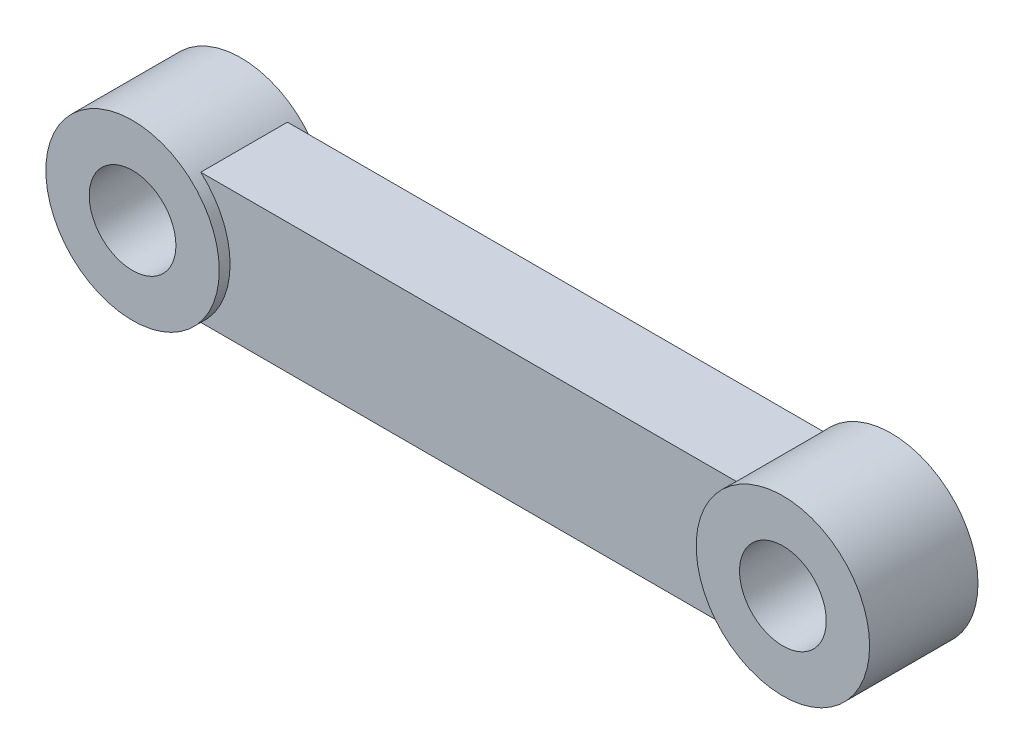
ISO-10303-21;
HEADER;
FILE_DESCRIPTION(('STEP AP214'),'2;1');
FILE_NAME('part.step','',(''),(''),'','','');
FILE_SCHEMA(('AUTOMOTIVE_DESIGN { 1 0 10303 214 1 1 1 1 }'));
ENDSEC;
DATA;
#1=APPLICATION_CONTEXT('core data for automotive mechanical design processes');
#2=APPLICATION_PROTOCOL_DEFINITION('international standard','automotive_design',2000,#1);
#3=PRODUCT_CONTEXT('',#1,'mechanical');
#4=PRODUCT('Part','Part','',(#3));
#5=PRODUCT_RELATED_PRODUCT_CATEGORY('part','',(#4));
#6=PRODUCT_DEFINITION_FORMATION('','',#4);
#7=PRODUCT_DEFINITION_CONTEXT('part definition',#1,'design');
#8=PRODUCT_DEFINITION('design','',#6,#7);
#9=PRODUCT_DEFINITION_SHAPE('','',#8);
#10=(LENGTH_UNIT() NAMED_UNIT(*) SI_UNIT(.MILLI.,.METRE.));
#11=(NAMED_UNIT(*) PLANE_ANGLE_UNIT() SI_UNIT($,.RADIAN.));
#12=(NAMED_UNIT(*) SI_UNIT($,.STERADIAN.) SOLID_ANGLE_UNIT());
#13=UNCERTAINTY_MEASURE_WITH_UNIT(LENGTH_MEASURE(1.E-05),#10,'distance_accuracy_value','');
#14=(GEOMETRIC_REPRESENTATION_CONTEXT(3) GLOBAL_UNCERTAINTY_ASSIGNED_CONTEXT((#13)) GLOBAL_UNIT_ASSIGNED_CONTEXT((#10,
#11,#12)) REPRESENTATION_CONTEXT('',''));
#15=CARTESIAN_POINT('',(0.,0.,0.));
#16=DIRECTION('',(0.,0.,1.));
#17=DIRECTION('',(1.,0.,0.));
#18=AXIS2_PLACEMENT_3D('',#15,#16,#17);
#19=CARTESIAN_POINT('',(0.,0.,10.));
#20=DIRECTION('',(0.,0.,1.));
#21=DIRECTION('',(1.,0.,0.));
#22=AXIS2_PLACEMENT_3D('',#19,#20,#21);
#23=PLANE('',#22);
#24=CARTESIAN_POINT('',(0.,0.,10.));
#25=DIRECTION('',(0.,0.,1.));
#26=DIRECTION('',(1.,0.,0.));
#27=AXIS2_PLACEMENT_3D('',#24,#25,#26);
#28=CIRCLE('',#27,8.);
#29=CARTESIAN_POINT('',(8.,0.,10.));
#30=VERTEX_POINT('',#29);
#31=EDGE_CURVE('E123',#30,#30,#28,.T.);
#32=ORIENTED_EDGE('',*,*,#31,.T.);
#33=EDGE_LOOP('',(#32));
#34=FACE_BOUND('',#33,.T.);
#35=CARTESIAN_POINT('',(0.,0.,10.));
#36=DIRECTION('',(0.,0.,1.));
#37=DIRECTION('',(1.,0.,0.));
#38=AXIS2_PLACEMENT_3D('',#35,#36,#37);
#39=CIRCLE('',#38,4.);
#40=CARTESIAN_POINT('',(4.,0.,10.));
#41=VERTEX_POINT('',#40);
#42=EDGE_CURVE('E115',#41,#41,#39,.T.);
#43=ORIENTED_EDGE('',*,*,#42,.F.);
#44=EDGE_LOOP('',(#43));
#45=FACE_BOUND('',#44,.T.);
#46=ADVANCED_FACE('F39',(#34,#45),#23,.T.);
#47=CARTESIAN_POINT('',(0.,0.,0.));
#48=DIRECTION('',(0.,0.,1.));
#49=DIRECTION('',(1.,0.,0.));
#50=AXIS2_PLACEMENT_3D('',#47,#48,#49);
#51=PLANE('',#50);
#52=CARTESIAN_POINT('',(0.,0.,0.));
#53=DIRECTION('',(0.,0.,1.));
#54=DIRECTION('',(1.,0.,0.));
#55=AXIS2_PLACEMENT_3D('',#52,#53,#54);
#56=CIRCLE('',#55,8.);
#57=CARTESIAN_POINT('',(8.,0.,0.));
#58=VERTEX_POINT('',#57);
#59=EDGE_CURVE('E119',#58,#58,#56,.T.);
#60=ORIENTED_EDGE('',*,*,#59,.F.);
#61=EDGE_LOOP('',(#60));
#62=FACE_BOUND('',#61,.T.);
#63=CARTESIAN_POINT('',(0.,0.,0.));
#64=DIRECTION('',(0.,0.,1.));
#65=DIRECTION('',(1.,0.,0.));
#66=AXIS2_PLACEMENT_3D('',#63,#64,#65);
#67=CIRCLE('',#66,4.);
#68=CARTESIAN_POINT('',(4.,0.,0.));
#69=VERTEX_POINT('',#68);
#70=EDGE_CURVE('E111',#69,#69,#67,.T.);
#71=ORIENTED_EDGE('',*,*,#70,.T.);
#72=EDGE_LOOP('',(#71));
#73=FACE_BOUND('',#72,.T.);
#74=ADVANCED_FACE('F135',(#62,#73),#51,.F.);
#75=CARTESIAN_POINT('',(0.,0.,10.));
#76=DIRECTION('',(0.,0.,-1.));
#77=DIRECTION('',(-1.,0.,0.));
#78=AXIS2_PLACEMENT_3D('',#75,#76,#77);
#79=CYLINDRICAL_SURFACE('',#78,8.);
#80=DIRECTION('',(0.,0.,-1.));
#81=VECTOR('',#80,1.);
#82=CARTESIAN_POINT('',(5.29150262212918,-6.,9.));
#83=LINE('',#82,#81);
#84=CARTESIAN_POINT('',(5.29150262212918,-6.,9.));
#85=VERTEX_POINT('',#84);
#86=CARTESIAN_POINT('',(5.29150262212918,-6.,0.999999999999999));
#87=VERTEX_POINT('',#86);
#88=EDGE_CURVE('E55',#85,#87,#83,.T.);
#89=ORIENTED_EDGE('',*,*,#88,.F.);
#90=CARTESIAN_POINT('',(0.,0.,9.));
#91=DIRECTION('',(0.,0.,1.));
#92=DIRECTION('',(1.,0.,0.));
#93=AXIS2_PLACEMENT_3D('',#90,#91,#92);
#94=CIRCLE('',#93,8.);
#95=CARTESIAN_POINT('',(5.29150262212918,6.,9.));
#96=VERTEX_POINT('',#95);
#97=EDGE_CURVE('E48',#85,#96,#94,.T.);
#98=ORIENTED_EDGE('',*,*,#97,.T.);
#99=DIRECTION('',(0.,0.,-1.));
#100=VECTOR('',#99,1.);
#101=CARTESIAN_POINT('',(5.29150262212918,6.,9.));
#102=LINE('',#101,#100);
#103=CARTESIAN_POINT('',(5.29150262212918,6.,1.));
#104=VERTEX_POINT('',#103);
#105=EDGE_CURVE('E99',#96,#104,#102,.T.);
#106=ORIENTED_EDGE('',*,*,#105,.T.);
#107=CARTESIAN_POINT('',(0.,0.,0.999999999999999));
#108=DIRECTION('',(0.,0.,1.));
#109=DIRECTION('',(1.,0.,0.));
#110=AXIS2_PLACEMENT_3D('',#107,#108,#109);
#111=CIRCLE('',#110,8.);
#112=EDGE_CURVE('E83',#87,#104,#111,.T.);
#113=ORIENTED_EDGE('',*,*,#112,.F.);
#114=EDGE_LOOP('',(#89,#98,#106,#113));
#115=FACE_BOUND('',#114,.T.);
#116=ORIENTED_EDGE('',*,*,#31,.F.);
#117=EDGE_LOOP('',(#116));
#118=FACE_BOUND('',#117,.T.);
#119=ORIENTED_EDGE('',*,*,#59,.T.);
#120=EDGE_LOOP('',(#119));
#121=FACE_BOUND('',#120,.T.);
#122=ADVANCED_FACE('F41',(#115,#118,#121),#79,.T.);
#123=CARTESIAN_POINT('',(0.,0.,10.));
#124=DIRECTION('',(0.,0.,-1.));
#125=DIRECTION('',(-1.,0.,0.));
#126=AXIS2_PLACEMENT_3D('',#123,#124,#125);
#127=CYLINDRICAL_SURFACE('',#126,4.);
#128=ORIENTED_EDGE('',*,*,#42,.T.);
#129=EDGE_LOOP('',(#128));
#130=FACE_BOUND('',#129,.T.);
#131=ORIENTED_EDGE('',*,*,#70,.F.);
#132=EDGE_LOOP('',(#131));
#133=FACE_BOUND('',#132,.T.);
#134=ADVANCED_FACE('F140',(#130,#133),#127,.F.);
#135=CARTESIAN_POINT('',(5.29150262212918,-6.,9.));
#136=DIRECTION('',(0.,1.,0.));
#137=DIRECTION('',(0.,0.,1.));
#138=AXIS2_PLACEMENT_3D('',#135,#136,#137);
#139=PLANE('',#138);
#140=DIRECTION('',(1.,0.,0.));
#141=VECTOR('',#140,1.);
#142=CARTESIAN_POINT('',(5.29150262212918,-6.,1.));
#143=LINE('',#142,#141);
#144=CARTESIAN_POINT('',(54.7084973778708,-6.,1.));
#145=VERTEX_POINT('',#144);
#146=EDGE_CURVE('E88',#87,#145,#143,.T.);
#147=ORIENTED_EDGE('',*,*,#146,.T.);
#148=DIRECTION('',(0.,0.,-1.));
#149=VECTOR('',#148,1.);
#150=CARTESIAN_POINT('',(54.7084973778708,-6.,9.));
#151=LINE('',#150,#149);
#152=CARTESIAN_POINT('',(54.7084973778708,-6.,9.));
#153=VERTEX_POINT('',#152);
#154=EDGE_CURVE('E98',#153,#145,#151,.T.);
#155=ORIENTED_EDGE('',*,*,#154,.F.);
#156=DIRECTION('',(1.,0.,0.));
#157=VECTOR('',#156,1.);
#158=CARTESIAN_POINT('',(5.29150262212918,-6.,9.));
#159=LINE('',#158,#157);
#160=EDGE_CURVE('E87',#85,#153,#159,.T.);
#161=ORIENTED_EDGE('',*,*,#160,.F.);
#162=ORIENTED_EDGE('',*,*,#88,.T.);
#163=EDGE_LOOP('',(#147,#155,#161,#162));
#164=FACE_BOUND('',#163,.T.);
#165=ADVANCED_FACE('F142',(#164),#139,.F.);
#166=CARTESIAN_POINT('',(5.29150262212918,6.,9.));
#167=DIRECTION('',(0.,-1.,0.));
#168=DIRECTION('',(0.,0.,-1.));
#169=AXIS2_PLACEMENT_3D('',#166,#167,#168);
#170=PLANE('',#169);
#171=DIRECTION('',(-1.,0.,0.));
#172=VECTOR('',#171,1.);
#173=CARTESIAN_POINT('',(5.29150262212918,6.,1.));
#174=LINE('',#173,#172);
#175=CARTESIAN_POINT('',(54.7084973778708,6.,0.999999999999999));
#176=VERTEX_POINT('',#175);
#177=EDGE_CURVE('E78',#176,#104,#174,.T.);
#178=ORIENTED_EDGE('',*,*,#177,.T.);
#179=ORIENTED_EDGE('',*,*,#105,.F.);
#180=DIRECTION('',(-1.,0.,0.));
#181=VECTOR('',#180,1.);
#182=CARTESIAN_POINT('',(5.29150262212918,6.,9.));
#183=LINE('',#182,#181);
#184=CARTESIAN_POINT('',(54.7084973778708,6.,9.));
#185=VERTEX_POINT('',#184);
#186=EDGE_CURVE('E94',#185,#96,#183,.T.);
#187=ORIENTED_EDGE('',*,*,#186,.F.);
#188=DIRECTION('',(0.,0.,-1.));
#189=VECTOR('',#188,1.);
#190=CARTESIAN_POINT('',(54.7084973778708,6.,9.));
#191=LINE('',#190,#189);
#192=EDGE_CURVE('E92',#185,#176,#191,.T.);
#193=ORIENTED_EDGE('',*,*,#192,.T.);
#194=EDGE_LOOP('',(#178,#179,#187,#193));
#195=FACE_BOUND('',#194,.T.);
#196=ADVANCED_FACE('F93',(#195),#170,.F.);
#197=CARTESIAN_POINT('',(0.,0.,9.));
#198=DIRECTION('',(0.,0.,1.));
#199=DIRECTION('',(1.,0.,0.));
#200=AXIS2_PLACEMENT_3D('',#197,#198,#199);
#201=PLANE('',#200);
#202=ORIENTED_EDGE('',*,*,#160,.T.);
#203=CARTESIAN_POINT('',(60.,0.,9.));
#204=DIRECTION('',(0.,0.,1.));
#205=DIRECTION('',(1.,0.,0.));
#206=AXIS2_PLACEMENT_3D('',#203,#204,#205);
#207=CIRCLE('',#206,8.);
#208=EDGE_CURVE('E105',#153,#185,#207,.F.);
#209=ORIENTED_EDGE('',*,*,#208,.T.);
#210=ORIENTED_EDGE('',*,*,#186,.T.);
#211=ORIENTED_EDGE('',*,*,#97,.F.);
#212=EDGE_LOOP('',(#202,#209,#210,#211));
#213=FACE_BOUND('',#212,.T.);
#214=ADVANCED_FACE('F185',(#213),#201,.T.);
#215=CARTESIAN_POINT('',(0.,0.,1.));
#216=DIRECTION('',(0.,0.,1.));
#217=DIRECTION('',(1.,0.,0.));
#218=AXIS2_PLACEMENT_3D('',#215,#216,#217);
#219=PLANE('',#218);
#220=CARTESIAN_POINT('',(60.,0.,0.999999999999999));
#221=DIRECTION('',(0.,0.,1.));
#222=DIRECTION('',(1.,0.,0.));
#223=AXIS2_PLACEMENT_3D('',#220,#221,#222);
#224=CIRCLE('',#223,8.);
#225=EDGE_CURVE('E11',#145,#176,#224,.F.);
#226=ORIENTED_EDGE('',*,*,#225,.F.);
#227=ORIENTED_EDGE('',*,*,#146,.F.);
#228=ORIENTED_EDGE('',*,*,#112,.T.);
#229=ORIENTED_EDGE('',*,*,#177,.F.);
#230=EDGE_LOOP('',(#226,#227,#228,#229));
#231=FACE_BOUND('',#230,.T.);
#232=ADVANCED_FACE('F80',(#231),#219,.F.);
#233=CARTESIAN_POINT('',(60.,0.,10.));
#234=DIRECTION('',(0.,0.,1.));
#235=DIRECTION('',(1.,0.,0.));
#236=AXIS2_PLACEMENT_3D('',#233,#234,#235);
#237=PLANE('',#236);
#238=CARTESIAN_POINT('',(60.,0.,10.));
#239=DIRECTION('',(0.,0.,1.));
#240=DIRECTION('',(1.,0.,0.));
#241=AXIS2_PLACEMENT_3D('',#238,#239,#240);
#242=CIRCLE('',#241,8.);
#243=CARTESIAN_POINT('',(68.,0.,10.));
#244=VERTEX_POINT('',#243);
#245=EDGE_CURVE('E257',#244,#244,#242,.T.);
#246=ORIENTED_EDGE('',*,*,#245,.T.);
#247=EDGE_LOOP('',(#246));
#248=FACE_BOUND('',#247,.T.);
#249=CARTESIAN_POINT('',(60.,0.,10.));
#250=DIRECTION('',(0.,0.,1.));
#251=DIRECTION('',(1.,0.,0.));
#252=AXIS2_PLACEMENT_3D('',#249,#250,#251);
#253=CIRCLE('',#252,4.00000000000001);
#254=CARTESIAN_POINT('',(64.,0.,10.));
#255=VERTEX_POINT('',#254);
#256=EDGE_CURVE('E246',#255,#255,#253,.T.);
#257=ORIENTED_EDGE('',*,*,#256,.F.);
#258=EDGE_LOOP('',(#257));
#259=FACE_BOUND('',#258,.T.);
#260=ADVANCED_FACE('F203',(#248,#259),#237,.T.);
#261=CARTESIAN_POINT('',(60.,0.,0.));
#262=DIRECTION('',(0.,0.,1.));
#263=DIRECTION('',(1.,0.,0.));
#264=AXIS2_PLACEMENT_3D('',#261,#262,#263);
#265=PLANE('',#264);
#266=CARTESIAN_POINT('',(60.,0.,0.));
#267=DIRECTION('',(0.,0.,1.));
#268=DIRECTION('',(1.,0.,0.));
#269=AXIS2_PLACEMENT_3D('',#266,#267,#268);
#270=CIRCLE('',#269,8.);
#271=CARTESIAN_POINT('',(68.,0.,0.));
#272=VERTEX_POINT('',#271);
#273=EDGE_CURVE('E254',#272,#272,#270,.T.);
#274=ORIENTED_EDGE('',*,*,#273,.F.);
#275=EDGE_LOOP('',(#274));
#276=FACE_BOUND('',#275,.T.);
#277=CARTESIAN_POINT('',(60.,0.,0.));
#278=DIRECTION('',(0.,0.,1.));
#279=DIRECTION('',(1.,0.,0.));
#280=AXIS2_PLACEMENT_3D('',#277,#278,#279);
#281=CIRCLE('',#280,4.00000000000001);
#282=CARTESIAN_POINT('',(64.,0.,0.));
#283=VERTEX_POINT('',#282);
#284=EDGE_CURVE('E249',#283,#283,#281,.T.);
#285=ORIENTED_EDGE('',*,*,#284,.T.);
#286=EDGE_LOOP('',(#285));
#287=FACE_BOUND('',#286,.T.);
#288=ADVANCED_FACE('F212',(#276,#287),#265,.F.);
#289=CARTESIAN_POINT('',(60.,0.,10.));
#290=DIRECTION('',(0.,0.,-1.));
#291=DIRECTION('',(-1.,0.,0.));
#292=AXIS2_PLACEMENT_3D('',#289,#290,#291);
#293=CYLINDRICAL_SURFACE('',#292,8.);
#294=ORIENTED_EDGE('',*,*,#208,.F.);
#295=ORIENTED_EDGE('',*,*,#154,.T.);
#296=ORIENTED_EDGE('',*,*,#225,.T.);
#297=ORIENTED_EDGE('',*,*,#192,.F.);
#298=EDGE_LOOP('',(#294,#295,#296,#297));
#299=FACE_BOUND('',#298,.T.);
#300=ORIENTED_EDGE('',*,*,#245,.F.);
#301=EDGE_LOOP('',(#300));
#302=FACE_BOUND('',#301,.T.);
#303=ORIENTED_EDGE('',*,*,#273,.T.);
#304=EDGE_LOOP('',(#303));
#305=FACE_BOUND('',#304,.T.);
#306=ADVANCED_FACE('F102',(#299,#302,#305),#293,.T.);
#307=CARTESIAN_POINT('',(60.,0.,10.));
#308=DIRECTION('',(0.,0.,-1.));
#309=DIRECTION('',(-1.,0.,0.));
#310=AXIS2_PLACEMENT_3D('',#307,#308,#309);
#311=CYLINDRICAL_SURFACE('',#310,4.00000000000001);
#312=ORIENTED_EDGE('',*,*,#256,.T.);
#313=EDGE_LOOP('',(#312));
#314=FACE_BOUND('',#313,.T.);
#315=ORIENTED_EDGE('',*,*,#284,.F.);
#316=EDGE_LOOP('',(#315));
#317=FACE_BOUND('',#316,.T.);
#318=ADVANCED_FACE('F231',(#314,#317),#311,.F.);
#319=CLOSED_SHELL('',(#46,#74,#122,#134,#165,#196,#214,#232,#260,#288,#306,#318));
#320=MANIFOLD_SOLID_BREP('B2',#319);
#321=ADVANCED_BREP_SHAPE_REPRESENTATION('',(#18,#320),#14);
#322=SHAPE_DEFINITION_REPRESENTATION(#9,#321);
ENDSEC;
END-ISO-10303-21;
